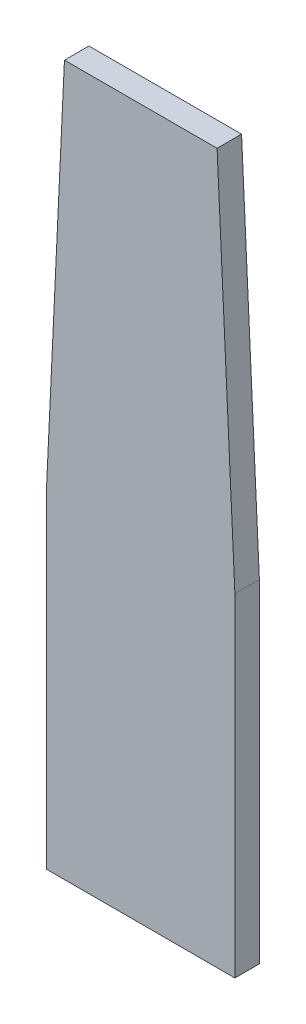
ISO-10303-21;
HEADER;
FILE_DESCRIPTION(('STEP AP214'),'2;1');
FILE_NAME('part.step','',(''),(''),'','','');
FILE_SCHEMA(('AUTOMOTIVE_DESIGN { 1 0 10303 214 1 1 1 1 }'));
ENDSEC;
DATA;
#1=APPLICATION_CONTEXT('core data for automotive mechanical design processes');
#2=APPLICATION_PROTOCOL_DEFINITION('international standard','automotive_design',2000,#1);
#3=PRODUCT_CONTEXT('',#1,'mechanical');
#4=PRODUCT('Part','Part','',(#3));
#5=PRODUCT_RELATED_PRODUCT_CATEGORY('part','',(#4));
#6=PRODUCT_DEFINITION_FORMATION('','',#4);
#7=PRODUCT_DEFINITION_CONTEXT('part definition',#1,'design');
#8=PRODUCT_DEFINITION('design','',#6,#7);
#9=PRODUCT_DEFINITION_SHAPE('','',#8);
#10=(LENGTH_UNIT() NAMED_UNIT(*) SI_UNIT(.MILLI.,.METRE.));
#11=(NAMED_UNIT(*) PLANE_ANGLE_UNIT() SI_UNIT($,.RADIAN.));
#12=(NAMED_UNIT(*) SI_UNIT($,.STERADIAN.) SOLID_ANGLE_UNIT());
#13=UNCERTAINTY_MEASURE_WITH_UNIT(LENGTH_MEASURE(1.E-05),#10,'distance_accuracy_value','');
#14=(GEOMETRIC_REPRESENTATION_CONTEXT(3) GLOBAL_UNCERTAINTY_ASSIGNED_CONTEXT((#13)) GLOBAL_UNIT_ASSIGNED_CONTEXT((#10,
#11,#12)) REPRESENTATION_CONTEXT('',''));
#15=CARTESIAN_POINT('',(0.,0.,0.));
#16=DIRECTION('',(0.,0.,1.));
#17=DIRECTION('',(1.,0.,0.));
#18=AXIS2_PLACEMENT_3D('',#15,#16,#17);
#19=CARTESIAN_POINT('',(-1.92307692307796,-15.,0.5));
#20=DIRECTION('',(1.,0.,0.));
#21=DIRECTION('',(0.,0.,-1.));
#22=AXIS2_PLACEMENT_3D('',#19,#20,#21);
#23=PLANE('',#22);
#24=DIRECTION('',(0.,1.,0.));
#25=VECTOR('',#24,1.);
#26=CARTESIAN_POINT('',(-1.92307692307796,-15.,1.));
#27=LINE('',#26,#25);
#28=CARTESIAN_POINT('',(-1.92307692307796,-15.,1.));
#29=VERTEX_POINT('',#28);
#30=CARTESIAN_POINT('',(-1.92307692307796,-8.19711538461538,1.));
#31=VERTEX_POINT('',#30);
#32=EDGE_CURVE('E82',#29,#31,#27,.T.);
#33=ORIENTED_EDGE('',*,*,#32,.T.);
#34=DIRECTION('',(0.,0.,1.));
#35=VECTOR('',#34,1.);
#36=CARTESIAN_POINT('',(-1.92307692307796,-8.19711538461538,0.5));
#37=LINE('',#36,#35);
#38=CARTESIAN_POINT('',(-1.92307692307796,-8.19711538461538,0.5));
#39=VERTEX_POINT('',#38);
#40=EDGE_CURVE('E124',#39,#31,#37,.T.);
#41=ORIENTED_EDGE('',*,*,#40,.F.);
#42=DIRECTION('',(0.,1.,0.));
#43=VECTOR('',#42,1.);
#44=CARTESIAN_POINT('',(-1.92307692307796,-15.,0.5));
#45=LINE('',#44,#43);
#46=CARTESIAN_POINT('',(-1.92307692307796,-15.,0.5));
#47=VERTEX_POINT('',#46);
#48=EDGE_CURVE('E61',#47,#39,#45,.T.);
#49=ORIENTED_EDGE('',*,*,#48,.F.);
#50=DIRECTION('',(0.,0.,1.));
#51=VECTOR('',#50,1.);
#52=CARTESIAN_POINT('',(-1.92307692307796,-15.,0.5));
#53=LINE('',#52,#51);
#54=EDGE_CURVE('E130',#47,#29,#53,.T.);
#55=ORIENTED_EDGE('',*,*,#54,.T.);
#56=EDGE_LOOP('',(#33,#41,#49,#55));
#57=FACE_BOUND('',#56,.T.);
#58=ADVANCED_FACE('F39',(#57),#23,.F.);
#59=CARTESIAN_POINT('',(1.92307692307589,-15.,0.5));
#60=DIRECTION('',(0.,1.,0.));
#61=DIRECTION('',(0.,0.,1.));
#62=AXIS2_PLACEMENT_3D('',#59,#60,#61);
#63=PLANE('',#62);
#64=DIRECTION('',(-1.,0.,0.));
#65=VECTOR('',#64,1.);
#66=CARTESIAN_POINT('',(1.92307692307589,-15.,1.));
#67=LINE('',#66,#65);
#68=CARTESIAN_POINT('',(1.92307692307589,-15.,1.));
#69=VERTEX_POINT('',#68);
#70=EDGE_CURVE('E113',#69,#29,#67,.T.);
#71=ORIENTED_EDGE('',*,*,#70,.T.);
#72=ORIENTED_EDGE('',*,*,#54,.F.);
#73=DIRECTION('',(-1.,0.,0.));
#74=VECTOR('',#73,1.);
#75=CARTESIAN_POINT('',(1.92307692307589,-15.,0.5));
#76=LINE('',#75,#74);
#77=CARTESIAN_POINT('',(1.92307692307589,-15.,0.5));
#78=VERTEX_POINT('',#77);
#79=EDGE_CURVE('E140',#78,#47,#76,.T.);
#80=ORIENTED_EDGE('',*,*,#79,.F.);
#81=DIRECTION('',(0.,0.,1.));
#82=VECTOR('',#81,1.);
#83=CARTESIAN_POINT('',(1.92307692307589,-15.,0.5));
#84=LINE('',#83,#82);
#85=EDGE_CURVE('E126',#78,#69,#84,.T.);
#86=ORIENTED_EDGE('',*,*,#85,.T.);
#87=EDGE_LOOP('',(#71,#72,#80,#86));
#88=FACE_BOUND('',#87,.T.);
#89=ADVANCED_FACE('F146',(#88),#63,.F.);
#90=CARTESIAN_POINT('',(1.92307692307589,-8.19711538461538,0.5));
#91=DIRECTION('',(-1.,0.,0.));
#92=DIRECTION('',(0.,0.,1.));
#93=AXIS2_PLACEMENT_3D('',#90,#91,#92);
#94=PLANE('',#93);
#95=DIRECTION('',(0.,-1.,0.));
#96=VECTOR('',#95,1.);
#97=CARTESIAN_POINT('',(1.92307692307589,-8.19711538461538,1.));
#98=LINE('',#97,#96);
#99=CARTESIAN_POINT('',(1.92307692307589,-8.19711538461538,1.));
#100=VERTEX_POINT('',#99);
#101=EDGE_CURVE('E111',#100,#69,#98,.T.);
#102=ORIENTED_EDGE('',*,*,#101,.T.);
#103=ORIENTED_EDGE('',*,*,#85,.F.);
#104=DIRECTION('',(0.,-1.,0.));
#105=VECTOR('',#104,1.);
#106=CARTESIAN_POINT('',(1.92307692307589,-8.19711538461538,0.5));
#107=LINE('',#106,#105);
#108=CARTESIAN_POINT('',(1.92307692307589,-8.19711538461538,0.5));
#109=VERTEX_POINT('',#108);
#110=EDGE_CURVE('E136',#109,#78,#107,.T.);
#111=ORIENTED_EDGE('',*,*,#110,.F.);
#112=DIRECTION('',(0.,0.,1.));
#113=VECTOR('',#112,1.);
#114=CARTESIAN_POINT('',(1.92307692307589,-8.19711538461538,0.5));
#115=LINE('',#114,#113);
#116=EDGE_CURVE('E43',#109,#100,#115,.T.);
#117=ORIENTED_EDGE('',*,*,#116,.T.);
#118=EDGE_LOOP('',(#102,#103,#111,#117));
#119=FACE_BOUND('',#118,.T.);
#120=ADVANCED_FACE('F134',(#119),#94,.F.);
#121=CARTESIAN_POINT('',(0.,0.,0.5));
#122=DIRECTION('',(0.,0.,-1.));
#123=DIRECTION('',(-1.,0.,0.));
#124=AXIS2_PLACEMENT_3D('',#121,#122,#123);
#125=PLANE('',#124);
#126=DIRECTION('',(-1.,0.,0.));
#127=VECTOR('',#126,1.);
#128=CARTESIAN_POINT('',(0.,-0.5,0.5));
#129=LINE('',#128,#127);
#130=CARTESIAN_POINT('',(1.55925463015463,-0.5,0.5));
#131=VERTEX_POINT('',#130);
#132=CARTESIAN_POINT('',(-1.5592546301567,-0.5,0.5));
#133=VERTEX_POINT('',#132);
#134=EDGE_CURVE('E142',#131,#133,#129,.T.);
#135=ORIENTED_EDGE('',*,*,#134,.F.);
#136=DIRECTION('',(0.0472146418634892,-0.998884766924445,0.));
#137=VECTOR('',#136,1.);
#138=CARTESIAN_POINT('',(1.15384615384512,8.07692307692308,0.5));
#139=LINE('',#138,#137);
#140=EDGE_CURVE('E91',#131,#109,#139,.T.);
#141=ORIENTED_EDGE('',*,*,#140,.T.);
#142=ORIENTED_EDGE('',*,*,#110,.T.);
#143=ORIENTED_EDGE('',*,*,#79,.T.);
#144=ORIENTED_EDGE('',*,*,#48,.T.);
#145=DIRECTION('',(0.0472146418634893,0.998884766924445,0.));
#146=VECTOR('',#145,1.);
#147=CARTESIAN_POINT('',(-1.92307692307796,-8.19711538461538,0.5));
#148=LINE('',#147,#146);
#149=EDGE_CURVE('E120',#39,#133,#148,.T.);
#150=ORIENTED_EDGE('',*,*,#149,.T.);
#151=EDGE_LOOP('',(#135,#141,#142,#143,#144,#150));
#152=FACE_BOUND('',#151,.T.);
#153=ADVANCED_FACE('F145',(#152),#125,.T.);
#154=CARTESIAN_POINT('',(-1.92307692307796,-8.19711538461538,0.5));
#155=DIRECTION('',(0.998884766924445,-0.0472146418634893,0.));
#156=DIRECTION('',(0.0472146418634893,0.998884766924445,0.));
#157=AXIS2_PLACEMENT_3D('',#154,#155,#156);
#158=PLANE('',#157);
#159=DIRECTION('',(0.0472146418634893,0.998884766924445,0.));
#160=VECTOR('',#159,1.);
#161=CARTESIAN_POINT('',(-1.92307692307796,-8.19711538461538,1.));
#162=LINE('',#161,#160);
#163=CARTESIAN_POINT('',(-1.5592546301567,-0.5,1.));
#164=VERTEX_POINT('',#163);
#165=EDGE_CURVE('E121',#31,#164,#162,.T.);
#166=ORIENTED_EDGE('',*,*,#165,.T.);
#167=DIRECTION('',(0.,0.,-1.));
#168=VECTOR('',#167,1.);
#169=CARTESIAN_POINT('',(-1.5592546301567,-0.5,0.5));
#170=LINE('',#169,#168);
#171=EDGE_CURVE('E102',#164,#133,#170,.T.);
#172=ORIENTED_EDGE('',*,*,#171,.T.);
#173=ORIENTED_EDGE('',*,*,#149,.F.);
#174=ORIENTED_EDGE('',*,*,#40,.T.);
#175=EDGE_LOOP('',(#166,#172,#173,#174));
#176=FACE_BOUND('',#175,.T.);
#177=ADVANCED_FACE('F144',(#176),#158,.F.);
#178=CARTESIAN_POINT('',(1.15384615384512,8.07692307692308,0.5));
#179=DIRECTION('',(-0.998884766924445,-0.0472146418634892,0.));
#180=DIRECTION('',(0.0472146418634893,-0.998884766924445,0.));
#181=AXIS2_PLACEMENT_3D('',#178,#179,#180);
#182=PLANE('',#181);
#183=ORIENTED_EDGE('',*,*,#140,.F.);
#184=DIRECTION('',(0.,0.,1.));
#185=VECTOR('',#184,1.);
#186=CARTESIAN_POINT('',(1.55925463015463,-0.5,0.5));
#187=LINE('',#186,#185);
#188=CARTESIAN_POINT('',(1.55925463015463,-0.5,1.));
#189=VERTEX_POINT('',#188);
#190=EDGE_CURVE('E54',#131,#189,#187,.T.);
#191=ORIENTED_EDGE('',*,*,#190,.T.);
#192=DIRECTION('',(0.0472146418634892,-0.998884766924445,0.));
#193=VECTOR('',#192,1.);
#194=CARTESIAN_POINT('',(1.15384615384512,8.07692307692308,1.));
#195=LINE('',#194,#193);
#196=EDGE_CURVE('E109',#189,#100,#195,.T.);
#197=ORIENTED_EDGE('',*,*,#196,.T.);
#198=ORIENTED_EDGE('',*,*,#116,.F.);
#199=EDGE_LOOP('',(#183,#191,#197,#198));
#200=FACE_BOUND('',#199,.T.);
#201=ADVANCED_FACE('F41',(#200),#182,.F.);
#202=CARTESIAN_POINT('',(0.,0.,1.));
#203=DIRECTION('',(0.,0.,-1.));
#204=DIRECTION('',(-1.,0.,0.));
#205=AXIS2_PLACEMENT_3D('',#202,#203,#204);
#206=PLANE('',#205);
#207=ORIENTED_EDGE('',*,*,#196,.F.);
#208=DIRECTION('',(-1.,0.,0.));
#209=VECTOR('',#208,1.);
#210=CARTESIAN_POINT('',(-17.,-0.5,1.));
#211=LINE('',#210,#209);
#212=EDGE_CURVE('E11',#189,#164,#211,.T.);
#213=ORIENTED_EDGE('',*,*,#212,.T.);
#214=ORIENTED_EDGE('',*,*,#165,.F.);
#215=ORIENTED_EDGE('',*,*,#32,.F.);
#216=ORIENTED_EDGE('',*,*,#70,.F.);
#217=ORIENTED_EDGE('',*,*,#101,.F.);
#218=EDGE_LOOP('',(#207,#213,#214,#215,#216,#217));
#219=FACE_BOUND('',#218,.T.);
#220=ADVANCED_FACE('F112',(#219),#206,.F.);
#221=CARTESIAN_POINT('',(-17.,-0.5,1.));
#222=DIRECTION('',(0.,-1.,0.));
#223=DIRECTION('',(0.,0.,-1.));
#224=AXIS2_PLACEMENT_3D('',#221,#222,#223);
#225=PLANE('',#224);
#226=ORIENTED_EDGE('',*,*,#134,.T.);
#227=ORIENTED_EDGE('',*,*,#171,.F.);
#228=ORIENTED_EDGE('',*,*,#212,.F.);
#229=ORIENTED_EDGE('',*,*,#190,.F.);
#230=EDGE_LOOP('',(#226,#227,#228,#229));
#231=FACE_BOUND('',#230,.T.);
#232=ADVANCED_FACE('F98',(#231),#225,.F.);
#233=CLOSED_SHELL('',(#58,#89,#120,#153,#177,#201,#220,#232));
#234=MANIFOLD_SOLID_BREP('B2',#233);
#235=ADVANCED_BREP_SHAPE_REPRESENTATION('',(#18,#234),#14);
#236=SHAPE_DEFINITION_REPRESENTATION(#9,#235);
ENDSEC;
END-ISO-10303-21;
